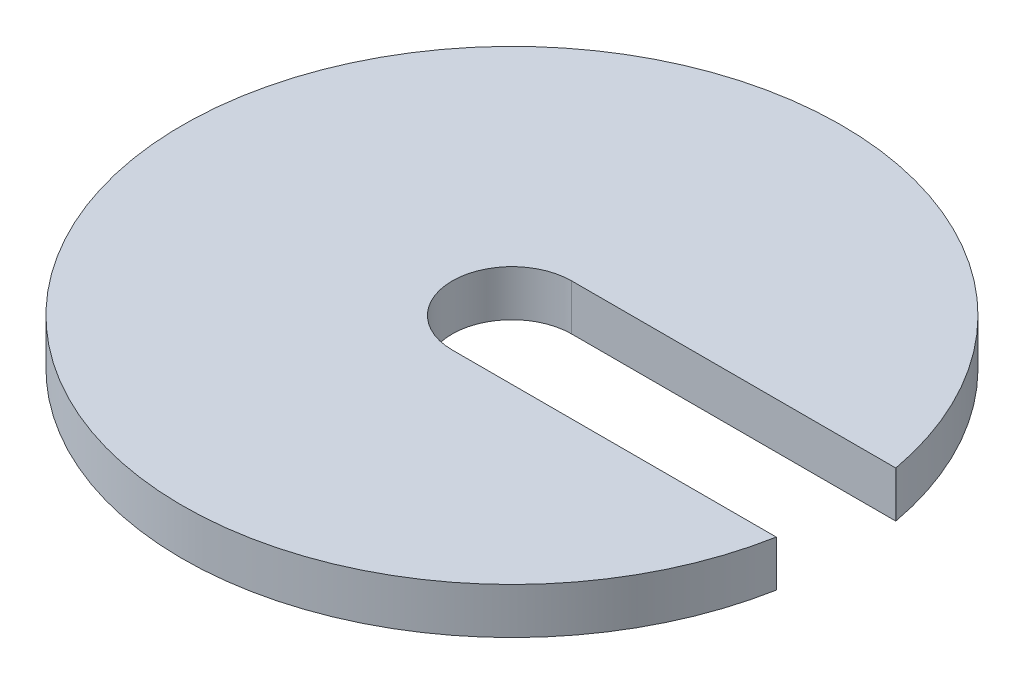
ISO-10303-21;
HEADER;
FILE_DESCRIPTION(('STEP AP214'),'2;1');
FILE_NAME('part.step','',(''),(''),'','','');
FILE_SCHEMA(('AUTOMOTIVE_DESIGN { 1 0 10303 214 1 1 1 1 }'));
ENDSEC;
DATA;
#1=APPLICATION_CONTEXT('core data for automotive mechanical design processes');
#2=APPLICATION_PROTOCOL_DEFINITION('international standard','automotive_design',2000,#1);
#3=PRODUCT_CONTEXT('',#1,'mechanical');
#4=PRODUCT('Part','Part','',(#3));
#5=PRODUCT_RELATED_PRODUCT_CATEGORY('part','',(#4));
#6=PRODUCT_DEFINITION_FORMATION('','',#4);
#7=PRODUCT_DEFINITION_CONTEXT('part definition',#1,'design');
#8=PRODUCT_DEFINITION('design','',#6,#7);
#9=PRODUCT_DEFINITION_SHAPE('','',#8);
#10=(LENGTH_UNIT() NAMED_UNIT(*) SI_UNIT(.MILLI.,.METRE.));
#11=(NAMED_UNIT(*) PLANE_ANGLE_UNIT() SI_UNIT($,.RADIAN.));
#12=(NAMED_UNIT(*) SI_UNIT($,.STERADIAN.) SOLID_ANGLE_UNIT());
#13=UNCERTAINTY_MEASURE_WITH_UNIT(LENGTH_MEASURE(1.E-05),#10,'distance_accuracy_value','');
#14=(GEOMETRIC_REPRESENTATION_CONTEXT(3) GLOBAL_UNCERTAINTY_ASSIGNED_CONTEXT((#13)) GLOBAL_UNIT_ASSIGNED_CONTEXT((#10,
#11,#12)) REPRESENTATION_CONTEXT('',''));
#15=CARTESIAN_POINT('',(0.,0.,0.));
#16=DIRECTION('',(0.,0.,1.));
#17=DIRECTION('',(1.,0.,0.));
#18=AXIS2_PLACEMENT_3D('',#15,#16,#17);
#19=CARTESIAN_POINT('',(21.1250956639411,3.,0.));
#20=DIRECTION('',(0.,-1.,0.));
#21=DIRECTION('',(0.,0.,-1.));
#22=AXIS2_PLACEMENT_3D('',#19,#20,#21);
#23=CYLINDRICAL_SURFACE('',#22,3.9);
#24=CARTESIAN_POINT('',(21.1250956639411,0.,0.));
#25=DIRECTION('',(0.,-1.,0.));
#26=DIRECTION('',(0.,0.,1.));
#27=AXIS2_PLACEMENT_3D('',#24,#25,#26);
#28=CIRCLE('',#27,3.9);
#29=CARTESIAN_POINT('',(21.1433283195842,0.,3.89995738057074));
#30=VERTEX_POINT('',#29);
#31=CARTESIAN_POINT('',(21.1250956639411,0.,3.9));
#32=VERTEX_POINT('',#31);
#33=EDGE_CURVE('E123',#30,#32,#28,.T.);
#34=ORIENTED_EDGE('',*,*,#33,.T.);
#35=DIRECTION('',(0.,-1.,0.));
#36=VECTOR('',#35,1.);
#37=CARTESIAN_POINT('',(21.1250956639411,3.,3.9));
#38=LINE('',#37,#36);
#39=CARTESIAN_POINT('',(21.1250956639411,3.,3.9));
#40=VERTEX_POINT('',#39);
#41=EDGE_CURVE('E11',#40,#32,#38,.T.);
#42=ORIENTED_EDGE('',*,*,#41,.F.);
#43=CARTESIAN_POINT('',(21.1250956639411,3.,0.));
#44=DIRECTION('',(0.,-1.,0.));
#45=DIRECTION('',(0.,0.,1.));
#46=AXIS2_PLACEMENT_3D('',#43,#44,#45);
#47=CIRCLE('',#46,3.9);
#48=CARTESIAN_POINT('',(21.1433283195842,3.,3.89995738057074));
#49=VERTEX_POINT('',#48);
#50=EDGE_CURVE('E134',#49,#40,#47,.T.);
#51=ORIENTED_EDGE('',*,*,#50,.F.);
#52=DIRECTION('',(0.,-1.,0.));
#53=VECTOR('',#52,1.);
#54=CARTESIAN_POINT('',(21.1433283195842,3.,3.89995738057074));
#55=LINE('',#54,#53);
#56=EDGE_CURVE('E116',#49,#30,#55,.T.);
#57=ORIENTED_EDGE('',*,*,#56,.T.);
#58=EDGE_LOOP('',(#34,#42,#51,#57));
#59=FACE_BOUND('',#58,.T.);
#60=ADVANCED_FACE('F39',(#59),#23,.F.);
#61=CARTESIAN_POINT('',(21.1250956639411,3.,3.9));
#62=DIRECTION('',(0.,0.,1.));
#63=DIRECTION('',(1.,0.,0.));
#64=AXIS2_PLACEMENT_3D('',#61,#62,#63);
#65=PLANE('',#64);
#66=DIRECTION('',(-1.,0.,0.));
#67=VECTOR('',#66,1.);
#68=CARTESIAN_POINT('',(21.1250956639411,0.,3.9));
#69=LINE('',#68,#67);
#70=CARTESIAN_POINT('',(0.,0.,3.9));
#71=VERTEX_POINT('',#70);
#72=EDGE_CURVE('E127',#32,#71,#69,.T.);
#73=ORIENTED_EDGE('',*,*,#72,.T.);
#74=DIRECTION('',(0.,-1.,0.));
#75=VECTOR('',#74,1.);
#76=CARTESIAN_POINT('',(0.,3.,3.9));
#77=LINE('',#76,#75);
#78=CARTESIAN_POINT('',(0.,3.,3.9));
#79=VERTEX_POINT('',#78);
#80=EDGE_CURVE('E50',#79,#71,#77,.T.);
#81=ORIENTED_EDGE('',*,*,#80,.F.);
#82=DIRECTION('',(-1.,0.,0.));
#83=VECTOR('',#82,1.);
#84=CARTESIAN_POINT('',(21.1250956639411,3.,3.9));
#85=LINE('',#84,#83);
#86=EDGE_CURVE('E95',#40,#79,#85,.T.);
#87=ORIENTED_EDGE('',*,*,#86,.F.);
#88=ORIENTED_EDGE('',*,*,#41,.T.);
#89=EDGE_LOOP('',(#73,#81,#87,#88));
#90=FACE_BOUND('',#89,.T.);
#91=ADVANCED_FACE('F160',(#90),#65,.F.);
#92=CARTESIAN_POINT('',(0.,3.,0.));
#93=DIRECTION('',(0.,-1.,0.));
#94=DIRECTION('',(0.,0.,-1.));
#95=AXIS2_PLACEMENT_3D('',#92,#93,#94);
#96=CYLINDRICAL_SURFACE('',#95,3.9);
#97=CARTESIAN_POINT('',(0.,0.,0.));
#98=DIRECTION('',(0.,-1.,0.));
#99=DIRECTION('',(0.,0.,1.));
#100=AXIS2_PLACEMENT_3D('',#97,#98,#99);
#101=CIRCLE('',#100,3.9);
#102=CARTESIAN_POINT('',(0.,0.,-3.9));
#103=VERTEX_POINT('',#102);
#104=EDGE_CURVE('E126',#71,#103,#101,.T.);
#105=ORIENTED_EDGE('',*,*,#104,.T.);
#106=DIRECTION('',(0.,-1.,0.));
#107=VECTOR('',#106,1.);
#108=CARTESIAN_POINT('',(0.,3.,-3.9));
#109=LINE('',#108,#107);
#110=CARTESIAN_POINT('',(0.,3.,-3.9));
#111=VERTEX_POINT('',#110);
#112=EDGE_CURVE('E111',#111,#103,#109,.T.);
#113=ORIENTED_EDGE('',*,*,#112,.F.);
#114=CARTESIAN_POINT('',(0.,3.,0.));
#115=DIRECTION('',(0.,-1.,0.));
#116=DIRECTION('',(0.,0.,1.));
#117=AXIS2_PLACEMENT_3D('',#114,#115,#116);
#118=CIRCLE('',#117,3.9);
#119=EDGE_CURVE('E104',#79,#111,#118,.T.);
#120=ORIENTED_EDGE('',*,*,#119,.F.);
#121=ORIENTED_EDGE('',*,*,#80,.T.);
#122=EDGE_LOOP('',(#105,#113,#120,#121));
#123=FACE_BOUND('',#122,.T.);
#124=ADVANCED_FACE('F137',(#123),#96,.F.);
#125=CARTESIAN_POINT('',(21.1250956639411,3.,-3.9));
#126=DIRECTION('',(0.,0.,-1.));
#127=DIRECTION('',(-1.,0.,0.));
#128=AXIS2_PLACEMENT_3D('',#125,#126,#127);
#129=PLANE('',#128);
#130=DIRECTION('',(1.,0.,0.));
#131=VECTOR('',#130,1.);
#132=CARTESIAN_POINT('',(21.1250956639411,0.,-3.9));
#133=LINE('',#132,#131);
#134=CARTESIAN_POINT('',(21.1250956639411,0.,-3.9));
#135=VERTEX_POINT('',#134);
#136=EDGE_CURVE('E114',#103,#135,#133,.T.);
#137=ORIENTED_EDGE('',*,*,#136,.T.);
#138=DIRECTION('',(0.,-1.,0.));
#139=VECTOR('',#138,1.);
#140=CARTESIAN_POINT('',(21.1250956639411,3.,-3.9));
#141=LINE('',#140,#139);
#142=CARTESIAN_POINT('',(21.1250956639411,3.,-3.9));
#143=VERTEX_POINT('',#142);
#144=EDGE_CURVE('E109',#143,#135,#141,.T.);
#145=ORIENTED_EDGE('',*,*,#144,.F.);
#146=DIRECTION('',(1.,0.,0.));
#147=VECTOR('',#146,1.);
#148=CARTESIAN_POINT('',(21.1250956639411,3.,-3.9));
#149=LINE('',#148,#147);
#150=EDGE_CURVE('E97',#111,#143,#149,.T.);
#151=ORIENTED_EDGE('',*,*,#150,.F.);
#152=ORIENTED_EDGE('',*,*,#112,.T.);
#153=EDGE_LOOP('',(#137,#145,#151,#152));
#154=FACE_BOUND('',#153,.T.);
#155=ADVANCED_FACE('F112',(#154),#129,.F.);
#156=CARTESIAN_POINT('',(21.1250956639411,3.,0.));
#157=DIRECTION('',(0.,-1.,0.));
#158=DIRECTION('',(0.,0.,-1.));
#159=AXIS2_PLACEMENT_3D('',#156,#157,#158);
#160=CYLINDRICAL_SURFACE('',#159,3.9);
#161=CARTESIAN_POINT('',(21.1250956639411,0.,0.));
#162=DIRECTION('',(0.,-1.,0.));
#163=DIRECTION('',(0.,0.,1.));
#164=AXIS2_PLACEMENT_3D('',#161,#162,#163);
#165=CIRCLE('',#164,3.9);
#166=CARTESIAN_POINT('',(21.1433283195842,0.,-3.89995738057074));
#167=VERTEX_POINT('',#166);
#168=EDGE_CURVE('E79',#135,#167,#165,.T.);
#169=ORIENTED_EDGE('',*,*,#168,.T.);
#170=DIRECTION('',(0.,-1.,0.));
#171=VECTOR('',#170,1.);
#172=CARTESIAN_POINT('',(21.1433283195842,3.,-3.89995738057074));
#173=LINE('',#172,#171);
#174=CARTESIAN_POINT('',(21.1433283195842,3.,-3.89995738057074));
#175=VERTEX_POINT('',#174);
#176=EDGE_CURVE('E113',#175,#167,#173,.T.);
#177=ORIENTED_EDGE('',*,*,#176,.F.);
#178=CARTESIAN_POINT('',(21.1250956639411,3.,0.));
#179=DIRECTION('',(0.,-1.,0.));
#180=DIRECTION('',(0.,0.,1.));
#181=AXIS2_PLACEMENT_3D('',#178,#179,#180);
#182=CIRCLE('',#181,3.9);
#183=EDGE_CURVE('E103',#143,#175,#182,.T.);
#184=ORIENTED_EDGE('',*,*,#183,.F.);
#185=ORIENTED_EDGE('',*,*,#144,.T.);
#186=EDGE_LOOP('',(#169,#177,#184,#185));
#187=FACE_BOUND('',#186,.T.);
#188=ADVANCED_FACE('F120',(#187),#160,.F.);
#189=CARTESIAN_POINT('',(0.,3.,0.));
#190=DIRECTION('',(0.,-1.,0.));
#191=DIRECTION('',(0.,0.,-1.));
#192=AXIS2_PLACEMENT_3D('',#189,#190,#191);
#193=CYLINDRICAL_SURFACE('',#192,21.5);
#194=CARTESIAN_POINT('',(0.,0.,0.));
#195=DIRECTION('',(0.,1.,0.));
#196=DIRECTION('',(0.,0.,1.));
#197=AXIS2_PLACEMENT_3D('',#194,#195,#196);
#198=CIRCLE('',#197,21.5);
#199=EDGE_CURVE('E82',#167,#30,#198,.T.);
#200=ORIENTED_EDGE('',*,*,#199,.T.);
#201=ORIENTED_EDGE('',*,*,#56,.F.);
#202=CARTESIAN_POINT('',(0.,3.,0.));
#203=DIRECTION('',(0.,1.,0.));
#204=DIRECTION('',(0.,0.,1.));
#205=AXIS2_PLACEMENT_3D('',#202,#203,#204);
#206=CIRCLE('',#205,21.5);
#207=EDGE_CURVE('E54',#175,#49,#206,.T.);
#208=ORIENTED_EDGE('',*,*,#207,.F.);
#209=ORIENTED_EDGE('',*,*,#176,.T.);
#210=EDGE_LOOP('',(#200,#201,#208,#209));
#211=FACE_BOUND('',#210,.T.);
#212=ADVANCED_FACE('F148',(#211),#193,.T.);
#213=CARTESIAN_POINT('',(21.1250956639411,3.,0.));
#214=DIRECTION('',(0.,1.,0.));
#215=DIRECTION('',(0.,0.,1.));
#216=AXIS2_PLACEMENT_3D('',#213,#214,#215);
#217=PLANE('',#216);
#218=ORIENTED_EDGE('',*,*,#50,.T.);
#219=ORIENTED_EDGE('',*,*,#86,.T.);
#220=ORIENTED_EDGE('',*,*,#119,.T.);
#221=ORIENTED_EDGE('',*,*,#150,.T.);
#222=ORIENTED_EDGE('',*,*,#183,.T.);
#223=ORIENTED_EDGE('',*,*,#207,.T.);
#224=EDGE_LOOP('',(#218,#219,#220,#221,#222,#223));
#225=FACE_BOUND('',#224,.T.);
#226=ADVANCED_FACE('F101',(#225),#217,.T.);
#227=CARTESIAN_POINT('',(21.1250956639411,0.,0.));
#228=DIRECTION('',(0.,1.,0.));
#229=DIRECTION('',(0.,0.,1.));
#230=AXIS2_PLACEMENT_3D('',#227,#228,#229);
#231=PLANE('',#230);
#232=ORIENTED_EDGE('',*,*,#33,.F.);
#233=ORIENTED_EDGE('',*,*,#199,.F.);
#234=ORIENTED_EDGE('',*,*,#168,.F.);
#235=ORIENTED_EDGE('',*,*,#136,.F.);
#236=ORIENTED_EDGE('',*,*,#104,.F.);
#237=ORIENTED_EDGE('',*,*,#72,.F.);
#238=EDGE_LOOP('',(#232,#233,#234,#235,#236,#237));
#239=FACE_BOUND('',#238,.T.);
#240=ADVANCED_FACE('F142',(#239),#231,.F.);
#241=CLOSED_SHELL('',(#60,#91,#124,#155,#188,#212,#226,#240));
#242=MANIFOLD_SOLID_BREP('B2',#241);
#243=ADVANCED_BREP_SHAPE_REPRESENTATION('',(#18,#242),#14);
#244=SHAPE_DEFINITION_REPRESENTATION(#9,#243);
ENDSEC;
END-ISO-10303-21;
